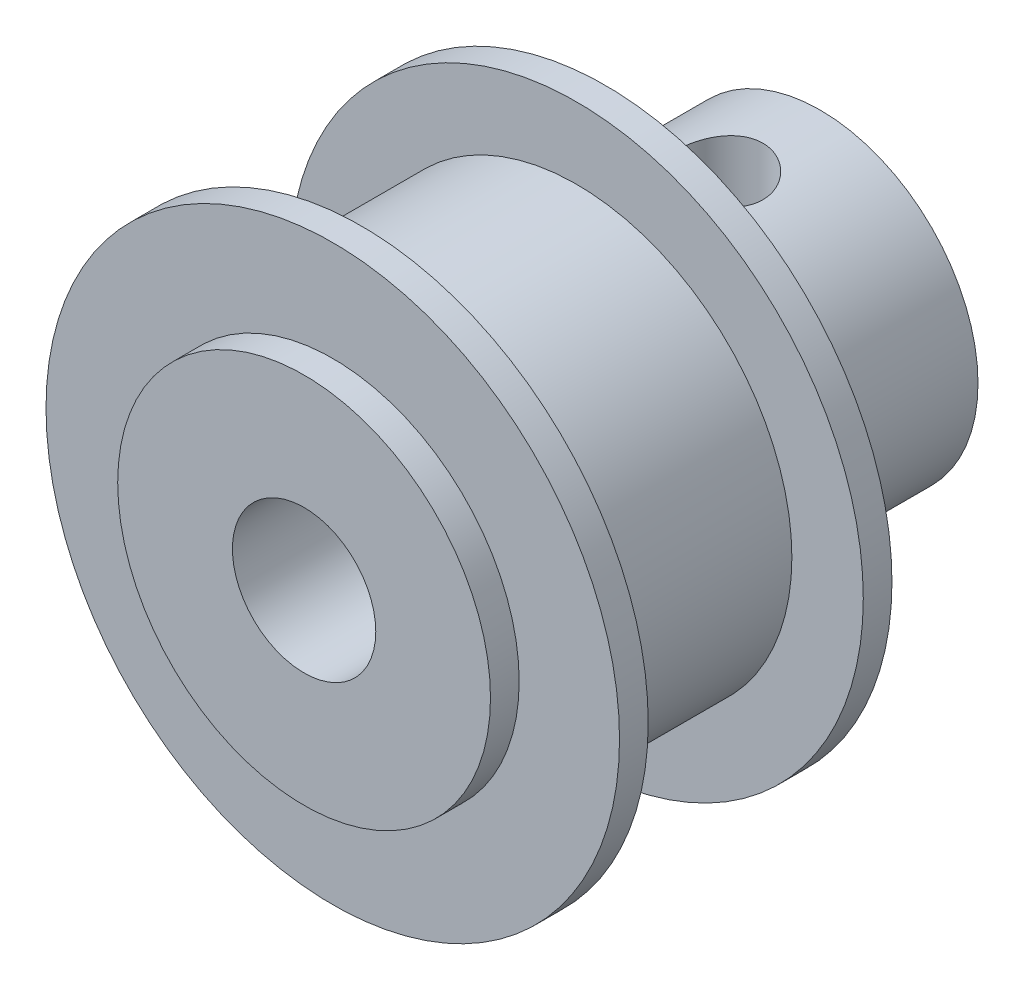
ISO-10303-21;
HEADER;
FILE_DESCRIPTION(('STEP AP214'),'2;1');
FILE_NAME('part.step','',(''),(''),'','','');
FILE_SCHEMA(('AUTOMOTIVE_DESIGN { 1 0 10303 214 1 1 1 1 }'));
ENDSEC;
DATA;
#1=APPLICATION_CONTEXT('core data for automotive mechanical design processes');
#2=APPLICATION_PROTOCOL_DEFINITION('international standard','automotive_design',2000,#1);
#3=PRODUCT_CONTEXT('',#1,'mechanical');
#4=PRODUCT('Part','Part','',(#3));
#5=PRODUCT_RELATED_PRODUCT_CATEGORY('part','',(#4));
#6=PRODUCT_DEFINITION_FORMATION('','',#4);
#7=PRODUCT_DEFINITION_CONTEXT('part definition',#1,'design');
#8=PRODUCT_DEFINITION('design','',#6,#7);
#9=PRODUCT_DEFINITION_SHAPE('','',#8);
#10=(LENGTH_UNIT() NAMED_UNIT(*) SI_UNIT(.MILLI.,.METRE.));
#11=(NAMED_UNIT(*) PLANE_ANGLE_UNIT() SI_UNIT($,.RADIAN.));
#12=(NAMED_UNIT(*) SI_UNIT($,.STERADIAN.) SOLID_ANGLE_UNIT());
#13=UNCERTAINTY_MEASURE_WITH_UNIT(LENGTH_MEASURE(1.E-05),#10,'distance_accuracy_value','');
#14=(GEOMETRIC_REPRESENTATION_CONTEXT(3) GLOBAL_UNCERTAINTY_ASSIGNED_CONTEXT((#13)) GLOBAL_UNIT_ASSIGNED_CONTEXT((#10,
#11,#12)) REPRESENTATION_CONTEXT('',''));
#15=CARTESIAN_POINT('',(0.,0.,0.));
#16=DIRECTION('',(0.,0.,1.));
#17=DIRECTION('',(1.,0.,0.));
#18=AXIS2_PLACEMENT_3D('',#15,#16,#17);
#19=CARTESIAN_POINT('',(0.,0.,6.5));
#20=DIRECTION('',(0.,0.,-1.));
#21=DIRECTION('',(-1.,0.,0.));
#22=AXIS2_PLACEMENT_3D('',#19,#20,#21);
#23=CYLINDRICAL_SURFACE('',#22,5.5);
#24=CARTESIAN_POINT('',(0.,5.5,5.));
#25=CARTESIAN_POINT('',(-0.0826209133321935,5.49999882717412,4.99999818738897));
#26=CARTESIAN_POINT('',(-0.165260978812708,5.49812007260761,4.99315093641658));
#27=CARTESIAN_POINT('',(-0.328155930157697,5.49080798085451,4.96599416969682));
#28=CARTESIAN_POINT('',(-0.408409727977264,5.48537304740499,4.9456786083714));
#29=CARTESIAN_POINT('',(-0.564157626055394,5.47154772174135,4.89229826826157));
#30=CARTESIAN_POINT('',(-0.639657866970163,5.46316123869395,4.85925034733808));
#31=CARTESIAN_POINT('',(-0.784044496159719,5.44431654412848,4.78140706733758));
#32=CARTESIAN_POINT('',(-0.852930363289776,5.43385816956517,4.73661078364607));
#33=CARTESIAN_POINT('',(-0.98379694757326,5.41171397042059,4.63540016353274));
#34=CARTESIAN_POINT('',(-1.04559512916994,5.4000064149043,4.5787545591458));
#35=CARTESIAN_POINT('',(-1.15894293682478,5.37682112935063,4.4559473639701));
#36=CARTESIAN_POINT('',(-1.21049117824721,5.36534343055203,4.38978448959769));
#37=CARTESIAN_POINT('',(-1.30277794539497,5.34369384163659,4.24834875242053));
#38=CARTESIAN_POINT('',(-1.34330426837586,5.33354930058623,4.17293285506372));
#39=CARTESIAN_POINT('',(-1.41102916361227,5.31603507411917,4.01603617180062));
#40=CARTESIAN_POINT('',(-1.43823031946844,5.30866485085754,3.93455656511151));
#41=CARTESIAN_POINT('',(-1.47789456441268,5.2977584719274,3.76987210498753));
#42=CARTESIAN_POINT('',(-1.49068960543229,5.29413612283787,3.68675305183808));
#43=CARTESIAN_POINT('',(-1.50221364409133,5.29087829084083,3.51947531699119));
#44=CARTESIAN_POINT('',(-1.50094540140882,5.2912420257326,3.43531684249998));
#45=CARTESIAN_POINT('',(-1.48464191780301,5.29583824875456,3.27095844903373));
#46=CARTESIAN_POINT('',(-1.47001073668932,5.29995718313671,3.19071476539777));
#47=CARTESIAN_POINT('',(-1.42804483871807,5.3114175579406,3.03386671397719));
#48=CARTESIAN_POINT('',(-1.40070906504647,5.31875926644153,2.9572626495337));
#49=CARTESIAN_POINT('',(-1.3337862982647,5.33593618292326,2.80882647945255));
#50=CARTESIAN_POINT('',(-1.29405951882947,5.34579959764141,2.73706079896638));
#51=CARTESIAN_POINT('',(-1.20357988022174,5.36689368797792,2.60107355259034));
#52=CARTESIAN_POINT('',(-1.15282476106209,5.37812464363249,2.53685353716126));
#53=CARTESIAN_POINT('',(-1.03967346682896,5.40115894990605,2.41547481019356));
#54=CARTESIAN_POINT('',(-0.976938646167249,5.41296874297114,2.35863255071106));
#55=CARTESIAN_POINT('',(-0.842682011788635,5.43548647707978,2.25620903502221));
#56=CARTESIAN_POINT('',(-0.771159819718553,5.44619437064292,2.21062826395038));
#57=CARTESIAN_POINT('',(-0.620853953739623,5.46537278121261,2.13187332722508));
#58=CARTESIAN_POINT('',(-0.542037637417772,5.47383251287305,2.09875866141606));
#59=CARTESIAN_POINT('',(-0.379672688714389,5.48748356142612,2.04634202748586));
#60=CARTESIAN_POINT('',(-0.296125144317681,5.49267562644564,2.02703689755586));
#61=CARTESIAN_POINT('',(-0.12936817048325,5.49909228776313,2.00328938220303));
#62=CARTESIAN_POINT('',(-0.0462242977839796,5.50043163125371,1.99841700467964));
#63=CARTESIAN_POINT('',(0.119693365637973,5.49932301585136,2.00248274751343));
#64=CARTESIAN_POINT('',(0.202467195532508,5.49687546782998,2.01141936961649));
#65=CARTESIAN_POINT('',(0.363745097739557,5.48854239265957,2.04249750270314));
#66=CARTESIAN_POINT('',(0.442299324272677,5.48271986472129,2.06439719275701));
#67=CARTESIAN_POINT('',(0.594609867448632,5.46829923535645,2.12049724464049));
#68=CARTESIAN_POINT('',(0.668365651304997,5.45970082634473,2.15469896966129));
#69=CARTESIAN_POINT('',(0.81064116119459,5.44041573828275,2.23521644228568));
#70=CARTESIAN_POINT('',(0.879024602412583,5.4296902954988,2.28176348726155));
#71=CARTESIAN_POINT('',(1.00716022013082,5.40738988410034,2.38536128754525));
#72=CARTESIAN_POINT('',(1.06691060617763,5.39581474001048,2.44241421615751));
#73=CARTESIAN_POINT('',(1.17791060344312,5.37269401558495,2.56741403803489));
#74=CARTESIAN_POINT('',(1.22885627747222,5.36115944983886,2.63563338227895));
#75=CARTESIAN_POINT('',(1.3185858220796,5.33980026187814,2.77989864721925));
#76=CARTESIAN_POINT('',(1.35737017925923,5.32997557125461,2.85594425460752));
#77=CARTESIAN_POINT('',(1.42138558317209,5.31326248703816,3.01334062824197));
#78=CARTESIAN_POINT('',(1.44669352306985,5.30635748202252,3.09465826052523));
#79=CARTESIAN_POINT('',(1.48320917220692,5.29626814696188,3.26061683802756));
#80=CARTESIAN_POINT('',(1.49442068863148,5.29308281231875,3.34525687955367));
#81=CARTESIAN_POINT('',(1.50219895576908,5.29088009671763,3.51233840381745));
#82=CARTESIAN_POINT('',(1.49925533217026,5.29172336001588,3.59475558872249));
#83=CARTESIAN_POINT('',(1.47994837643976,5.29715501736986,3.75787064773497));
#84=CARTESIAN_POINT('',(1.46358542028567,5.30174330649891,3.83856856994704));
#85=CARTESIAN_POINT('',(1.41819408435119,5.31406316491799,3.99530631577612));
#86=CARTESIAN_POINT('',(1.38927395449127,5.32176783125817,4.07137975324176));
#87=CARTESIAN_POINT('',(1.31967304541386,5.33945189987963,4.21765327681334));
#88=CARTESIAN_POINT('',(1.27899034504456,5.34943167369227,4.28785240106517));
#89=CARTESIAN_POINT('',(1.18555430984851,5.37092379381814,4.42271059769265));
#90=CARTESIAN_POINT('',(1.13246901822125,5.38247375845259,4.48713370484311));
#91=CARTESIAN_POINT('',(1.01636011199274,5.40559990490855,4.6063164067946));
#92=CARTESIAN_POINT('',(0.953334059387994,5.41717609247304,4.66107362400533));
#93=CARTESIAN_POINT('',(0.817407725686078,5.43936459177359,4.7605946145194));
#94=CARTESIAN_POINT('',(0.744315866262519,5.44994907753807,4.80510348086698));
#95=CARTESIAN_POINT('',(0.591399899839278,5.46865263780403,4.88113243621147));
#96=CARTESIAN_POINT('',(0.51157995242122,5.47677322151197,4.91266048055433));
#97=CARTESIAN_POINT('',(0.36010010121821,5.48864193995757,4.95793950997899));
#98=CARTESIAN_POINT('',(0.289064640262467,5.49286947681091,4.9736745512417));
#99=CARTESIAN_POINT('',(0.145357607941484,5.49854887164354,4.99470502531883));
#100=CARTESIAN_POINT('',(0.0726862155649468,5.5000010318002,5.0000015946548));
#101=CARTESIAN_POINT('',(0.,5.5,5.));
#102=B_SPLINE_CURVE_WITH_KNOTS('',3,(#24,#25,#26,#27,#28,#29,#30,#31,#32,#33,#34,#35,#36,#37,
#38,#39,#40,#41,#42,#43,#44,#45,#46,#47,#48,#49,#50,#51,#52,#53,#54,#55,#56,#57,#58,#59,#60,#61,
#62,#63,#64,#65,#66,#67,#68,#69,#70,#71,#72,#73,#74,#75,#76,#77,#78,#79,#80,#81,#82,#83,#84,#85,
#86,#87,#88,#89,#90,#91,#92,#93,#94,#95,#96,#97,#98,#99,#100,#101),.UNSPECIFIED.,.T.,.F.,(4,2,2,
2,2,2,2,2,2,2,2,2,2,2,2,2,2,2,2,2,2,2,2,2,2,2,2,2,2,2,2,2,2,2,2,2,2,2,4),(0.,0.247596106854897,
0.495303428551299,0.742683902420579,0.990083851364706,1.24285878223178,1.49566783659324,
1.75304593650219,2.01037411390996,2.26164304860926,2.51286267696538,2.75672886674887,
3.00061534583717,3.24735926767928,3.49415380139121,3.74938528550775,4.00462776284424,
4.26107349736028,4.51746049766944,4.76612811343082,5.0147687510525,5.25891111200195,
5.50308053475836,5.75219469009681,6.00136043656003,6.25790073064869,6.51443075867912,
6.76948096455404,7.0244622712421,7.27068852228629,7.51690787489588,7.76104555655817,
8.00522313517586,8.25689011392091,8.50861891104974,8.76605872289058,9.02334052607436,
9.24118832093189,9.45901239561305),.UNSPECIFIED.);
#103=CARTESIAN_POINT('',(0.,5.5,5.));
#104=VERTEX_POINT('',#103);
#105=EDGE_CURVE('E10',#104,#104,#102,.T.);
#106=ORIENTED_EDGE('',*,*,#105,.T.);
#107=EDGE_LOOP('',(#106));
#108=FACE_BOUND('',#107,.T.);
#109=CARTESIAN_POINT('',(0.,0.,6.5));
#110=DIRECTION('',(0.,0.,1.));
#111=DIRECTION('',(1.,0.,0.));
#112=AXIS2_PLACEMENT_3D('',#109,#110,#111);
#113=CIRCLE('',#112,5.5);
#114=CARTESIAN_POINT('',(5.5,0.,6.5));
#115=VERTEX_POINT('',#114);
#116=EDGE_CURVE('E64',#115,#115,#113,.T.);
#117=ORIENTED_EDGE('',*,*,#116,.F.);
#118=EDGE_LOOP('',(#117));
#119=FACE_BOUND('',#118,.T.);
#120=CARTESIAN_POINT('',(0.,0.,0.));
#121=DIRECTION('',(0.,0.,1.));
#122=DIRECTION('',(1.,0.,0.));
#123=AXIS2_PLACEMENT_3D('',#120,#121,#122);
#124=CIRCLE('',#123,5.5);
#125=CARTESIAN_POINT('',(5.5,0.,0.));
#126=VERTEX_POINT('',#125);
#127=EDGE_CURVE('E95',#126,#126,#124,.T.);
#128=ORIENTED_EDGE('',*,*,#127,.T.);
#129=EDGE_LOOP('',(#128));
#130=FACE_BOUND('',#129,.T.);
#131=ADVANCED_FACE('F41',(#108,#119,#130),#23,.T.);
#132=CARTESIAN_POINT('',(0.,0.,0.));
#133=DIRECTION('',(0.,0.,1.));
#134=DIRECTION('',(1.,0.,0.));
#135=AXIS2_PLACEMENT_3D('',#132,#133,#134);
#136=PLANE('',#135);
#137=CARTESIAN_POINT('',(0.,0.,0.));
#138=DIRECTION('',(0.,0.,1.));
#139=DIRECTION('',(1.,0.,0.));
#140=AXIS2_PLACEMENT_3D('',#137,#138,#139);
#141=CIRCLE('',#140,2.5);
#142=CARTESIAN_POINT('',(2.5,0.,0.));
#143=VERTEX_POINT('',#142);
#144=EDGE_CURVE('E173',#143,#143,#141,.T.);
#145=ORIENTED_EDGE('',*,*,#144,.T.);
#146=EDGE_LOOP('',(#145));
#147=FACE_BOUND('',#146,.T.);
#148=ORIENTED_EDGE('',*,*,#127,.F.);
#149=EDGE_LOOP('',(#148));
#150=FACE_BOUND('',#149,.T.);
#151=ADVANCED_FACE('F106',(#147,#150),#136,.F.);
#152=CARTESIAN_POINT('',(0.,0.,7.5));
#153=DIRECTION('',(0.,0.,-1.));
#154=DIRECTION('',(-1.,0.,0.));
#155=AXIS2_PLACEMENT_3D('',#152,#153,#154);
#156=CYLINDRICAL_SURFACE('',#155,6.5);
#157=CARTESIAN_POINT('',(0.,0.,7.5));
#158=DIRECTION('',(0.,0.,1.));
#159=DIRECTION('',(1.,0.,0.));
#160=AXIS2_PLACEMENT_3D('',#157,#158,#159);
#161=CIRCLE('',#160,6.5);
#162=CARTESIAN_POINT('',(6.5,0.,7.5));
#163=VERTEX_POINT('',#162);
#164=EDGE_CURVE('E91',#163,#163,#161,.T.);
#165=ORIENTED_EDGE('',*,*,#164,.F.);
#166=EDGE_LOOP('',(#165));
#167=FACE_BOUND('',#166,.T.);
#168=CARTESIAN_POINT('',(0.,0.,6.5));
#169=DIRECTION('',(0.,0.,1.));
#170=DIRECTION('',(1.,0.,0.));
#171=AXIS2_PLACEMENT_3D('',#168,#169,#170);
#172=CIRCLE('',#171,6.5);
#173=CARTESIAN_POINT('',(6.5,0.,6.5));
#174=VERTEX_POINT('',#173);
#175=EDGE_CURVE('E87',#174,#174,#172,.T.);
#176=ORIENTED_EDGE('',*,*,#175,.T.);
#177=EDGE_LOOP('',(#176));
#178=FACE_BOUND('',#177,.T.);
#179=ADVANCED_FACE('F108',(#167,#178),#156,.T.);
#180=CARTESIAN_POINT('',(0.,0.,6.5));
#181=DIRECTION('',(0.,0.,1.));
#182=DIRECTION('',(1.,0.,0.));
#183=AXIS2_PLACEMENT_3D('',#180,#181,#182);
#184=PLANE('',#183);
#185=ORIENTED_EDGE('',*,*,#116,.T.);
#186=EDGE_LOOP('',(#185));
#187=FACE_BOUND('',#186,.T.);
#188=ORIENTED_EDGE('',*,*,#175,.F.);
#189=EDGE_LOOP('',(#188));
#190=FACE_BOUND('',#189,.T.);
#191=ADVANCED_FACE('F114',(#187,#190),#184,.F.);
#192=CARTESIAN_POINT('',(0.,0.,8.5));
#193=DIRECTION('',(0.,0.,-1.));
#194=DIRECTION('',(-1.,0.,0.));
#195=AXIS2_PLACEMENT_3D('',#192,#193,#194);
#196=CYLINDRICAL_SURFACE('',#195,10.);
#197=CARTESIAN_POINT('',(0.,0.,8.5));
#198=DIRECTION('',(0.,0.,1.));
#199=DIRECTION('',(1.,0.,0.));
#200=AXIS2_PLACEMENT_3D('',#197,#198,#199);
#201=CIRCLE('',#200,10.);
#202=CARTESIAN_POINT('',(10.,0.,8.5));
#203=VERTEX_POINT('',#202);
#204=EDGE_CURVE('E83',#203,#203,#201,.T.);
#205=ORIENTED_EDGE('',*,*,#204,.F.);
#206=EDGE_LOOP('',(#205));
#207=FACE_BOUND('',#206,.T.);
#208=CARTESIAN_POINT('',(0.,0.,7.5));
#209=DIRECTION('',(0.,0.,1.));
#210=DIRECTION('',(1.,0.,0.));
#211=AXIS2_PLACEMENT_3D('',#208,#209,#210);
#212=CIRCLE('',#211,10.);
#213=CARTESIAN_POINT('',(10.,0.,7.5));
#214=VERTEX_POINT('',#213);
#215=EDGE_CURVE('E81',#214,#214,#212,.T.);
#216=ORIENTED_EDGE('',*,*,#215,.T.);
#217=EDGE_LOOP('',(#216));
#218=FACE_BOUND('',#217,.T.);
#219=ADVANCED_FACE('F121',(#207,#218),#196,.T.);
#220=CARTESIAN_POINT('',(0.,0.,8.5));
#221=DIRECTION('',(0.,0.,1.));
#222=DIRECTION('',(1.,0.,0.));
#223=AXIS2_PLACEMENT_3D('',#220,#221,#222);
#224=PLANE('',#223);
#225=CARTESIAN_POINT('',(0.,0.,8.5));
#226=DIRECTION('',(0.,0.,1.));
#227=DIRECTION('',(1.,0.,0.));
#228=AXIS2_PLACEMENT_3D('',#225,#226,#227);
#229=CIRCLE('',#228,7.51);
#230=CARTESIAN_POINT('',(7.51,0.,8.5));
#231=VERTEX_POINT('',#230);
#232=EDGE_CURVE('E58',#231,#231,#229,.T.);
#233=ORIENTED_EDGE('',*,*,#232,.F.);
#234=EDGE_LOOP('',(#233));
#235=FACE_BOUND('',#234,.T.);
#236=ORIENTED_EDGE('',*,*,#204,.T.);
#237=EDGE_LOOP('',(#236));
#238=FACE_BOUND('',#237,.T.);
#239=ADVANCED_FACE('F125',(#235,#238),#224,.T.);
#240=CARTESIAN_POINT('',(0.,0.,7.5));
#241=DIRECTION('',(0.,0.,1.));
#242=DIRECTION('',(1.,0.,0.));
#243=AXIS2_PLACEMENT_3D('',#240,#241,#242);
#244=PLANE('',#243);
#245=ORIENTED_EDGE('',*,*,#164,.T.);
#246=EDGE_LOOP('',(#245));
#247=FACE_BOUND('',#246,.T.);
#248=ORIENTED_EDGE('',*,*,#215,.F.);
#249=EDGE_LOOP('',(#248));
#250=FACE_BOUND('',#249,.T.);
#251=ADVANCED_FACE('F127',(#247,#250),#244,.F.);
#252=CARTESIAN_POINT('',(0.,0.,16.));
#253=DIRECTION('',(0.,0.,-1.));
#254=DIRECTION('',(-1.,0.,0.));
#255=AXIS2_PLACEMENT_3D('',#252,#253,#254);
#256=CYLINDRICAL_SURFACE('',#255,7.51);
#257=CARTESIAN_POINT('',(0.,0.,16.));
#258=DIRECTION('',(0.,0.,1.));
#259=DIRECTION('',(1.,0.,0.));
#260=AXIS2_PLACEMENT_3D('',#257,#258,#259);
#261=CIRCLE('',#260,7.51);
#262=CARTESIAN_POINT('',(7.51,0.,16.));
#263=VERTEX_POINT('',#262);
#264=EDGE_CURVE('E74',#263,#263,#261,.T.);
#265=ORIENTED_EDGE('',*,*,#264,.F.);
#266=EDGE_LOOP('',(#265));
#267=FACE_BOUND('',#266,.T.);
#268=ORIENTED_EDGE('',*,*,#232,.T.);
#269=EDGE_LOOP('',(#268));
#270=FACE_BOUND('',#269,.T.);
#271=ADVANCED_FACE('F130',(#267,#270),#256,.T.);
#272=CARTESIAN_POINT('',(0.,0.,17.));
#273=DIRECTION('',(0.,0.,-1.));
#274=DIRECTION('',(-1.,0.,0.));
#275=AXIS2_PLACEMENT_3D('',#272,#273,#274);
#276=CYLINDRICAL_SURFACE('',#275,10.);
#277=CARTESIAN_POINT('',(0.,0.,17.));
#278=DIRECTION('',(0.,0.,1.));
#279=DIRECTION('',(1.,0.,0.));
#280=AXIS2_PLACEMENT_3D('',#277,#278,#279);
#281=CIRCLE('',#280,10.);
#282=CARTESIAN_POINT('',(10.,0.,17.));
#283=VERTEX_POINT('',#282);
#284=EDGE_CURVE('E70',#283,#283,#281,.T.);
#285=ORIENTED_EDGE('',*,*,#284,.F.);
#286=EDGE_LOOP('',(#285));
#287=FACE_BOUND('',#286,.T.);
#288=CARTESIAN_POINT('',(0.,0.,16.));
#289=DIRECTION('',(0.,0.,1.));
#290=DIRECTION('',(1.,0.,0.));
#291=AXIS2_PLACEMENT_3D('',#288,#289,#290);
#292=CIRCLE('',#291,10.);
#293=CARTESIAN_POINT('',(10.,0.,16.));
#294=VERTEX_POINT('',#293);
#295=EDGE_CURVE('E75',#294,#294,#292,.T.);
#296=ORIENTED_EDGE('',*,*,#295,.T.);
#297=EDGE_LOOP('',(#296));
#298=FACE_BOUND('',#297,.T.);
#299=ADVANCED_FACE('F137',(#287,#298),#276,.T.);
#300=CARTESIAN_POINT('',(0.,0.,17.));
#301=DIRECTION('',(0.,0.,1.));
#302=DIRECTION('',(1.,0.,0.));
#303=AXIS2_PLACEMENT_3D('',#300,#301,#302);
#304=PLANE('',#303);
#305=CARTESIAN_POINT('',(0.,0.,17.));
#306=DIRECTION('',(0.,0.,1.));
#307=DIRECTION('',(1.,0.,0.));
#308=AXIS2_PLACEMENT_3D('',#305,#306,#307);
#309=CIRCLE('',#308,6.5);
#310=CARTESIAN_POINT('',(6.5,0.,17.));
#311=VERTEX_POINT('',#310);
#312=EDGE_CURVE('E53',#311,#311,#309,.T.);
#313=ORIENTED_EDGE('',*,*,#312,.F.);
#314=EDGE_LOOP('',(#313));
#315=FACE_BOUND('',#314,.T.);
#316=ORIENTED_EDGE('',*,*,#284,.T.);
#317=EDGE_LOOP('',(#316));
#318=FACE_BOUND('',#317,.T.);
#319=ADVANCED_FACE('F141',(#315,#318),#304,.T.);
#320=CARTESIAN_POINT('',(0.,0.,16.));
#321=DIRECTION('',(0.,0.,1.));
#322=DIRECTION('',(1.,0.,0.));
#323=AXIS2_PLACEMENT_3D('',#320,#321,#322);
#324=PLANE('',#323);
#325=ORIENTED_EDGE('',*,*,#264,.T.);
#326=EDGE_LOOP('',(#325));
#327=FACE_BOUND('',#326,.T.);
#328=ORIENTED_EDGE('',*,*,#295,.F.);
#329=EDGE_LOOP('',(#328));
#330=FACE_BOUND('',#329,.T.);
#331=ADVANCED_FACE('F143',(#327,#330),#324,.F.);
#332=CARTESIAN_POINT('',(0.,0.,18.));
#333=DIRECTION('',(0.,0.,-1.));
#334=DIRECTION('',(-1.,0.,0.));
#335=AXIS2_PLACEMENT_3D('',#332,#333,#334);
#336=CYLINDRICAL_SURFACE('',#335,6.5);
#337=CARTESIAN_POINT('',(0.,0.,18.));
#338=DIRECTION('',(0.,0.,1.));
#339=DIRECTION('',(1.,0.,0.));
#340=AXIS2_PLACEMENT_3D('',#337,#338,#339);
#341=CIRCLE('',#340,6.5);
#342=CARTESIAN_POINT('',(6.5,0.,18.));
#343=VERTEX_POINT('',#342);
#344=EDGE_CURVE('E68',#343,#343,#341,.T.);
#345=ORIENTED_EDGE('',*,*,#344,.F.);
#346=EDGE_LOOP('',(#345));
#347=FACE_BOUND('',#346,.T.);
#348=ORIENTED_EDGE('',*,*,#312,.T.);
#349=EDGE_LOOP('',(#348));
#350=FACE_BOUND('',#349,.T.);
#351=ADVANCED_FACE('F146',(#347,#350),#336,.T.);
#352=CARTESIAN_POINT('',(0.,0.,18.));
#353=DIRECTION('',(0.,0.,1.));
#354=DIRECTION('',(1.,0.,0.));
#355=AXIS2_PLACEMENT_3D('',#352,#353,#354);
#356=PLANE('',#355);
#357=CARTESIAN_POINT('',(0.,0.,18.));
#358=DIRECTION('',(0.,0.,1.));
#359=DIRECTION('',(1.,0.,0.));
#360=AXIS2_PLACEMENT_3D('',#357,#358,#359);
#361=CIRCLE('',#360,2.5);
#362=CARTESIAN_POINT('',(2.5,0.,18.));
#363=VERTEX_POINT('',#362);
#364=EDGE_CURVE('E172',#363,#363,#361,.T.);
#365=ORIENTED_EDGE('',*,*,#364,.F.);
#366=EDGE_LOOP('',(#365));
#367=FACE_BOUND('',#366,.T.);
#368=ORIENTED_EDGE('',*,*,#344,.T.);
#369=EDGE_LOOP('',(#368));
#370=FACE_BOUND('',#369,.T.);
#371=ADVANCED_FACE('F153',(#367,#370),#356,.T.);
#372=CARTESIAN_POINT('',(0.,0.,0.));
#373=DIRECTION('',(0.,0.,1.));
#374=DIRECTION('',(1.,0.,0.));
#375=AXIS2_PLACEMENT_3D('',#372,#373,#374);
#376=CYLINDRICAL_SURFACE('',#375,2.5);
#377=CARTESIAN_POINT('',(0.,2.5,5.));
#378=CARTESIAN_POINT('',(0.0767298334620161,2.49999625789732,4.99999590899012));
#379=CARTESIAN_POINT('',(0.153582320644178,2.4964290461501,4.99407132907374));
#380=CARTESIAN_POINT('',(0.304975509530679,2.48249903608568,4.97067568048467));
#381=CARTESIAN_POINT('',(0.379510034596047,2.47211948032719,4.95317613814577));
#382=CARTESIAN_POINT('',(0.523751827790837,2.44561558054488,4.90761363883314));
#383=CARTESIAN_POINT('',(0.593481028226566,2.42951973272944,4.87960304183684));
#384=CARTESIAN_POINT('',(0.727030318214659,2.39295367626407,4.81413966685897));
#385=CARTESIAN_POINT('',(0.790851869416383,2.37248455380255,4.77668923303125));
#386=CARTESIAN_POINT('',(0.916299278999315,2.32705360719088,4.69022517329142));
#387=CARTESIAN_POINT('',(0.977384020081415,2.30186792195985,4.64054630464861));
#388=CARTESIAN_POINT('',(1.09088270411891,2.25030439279634,4.53253279617173));
#389=CARTESIAN_POINT('',(1.14328534948112,2.22392505153571,4.47418706281268));
#390=CARTESIAN_POINT('',(1.24444996762974,2.1691106699591,4.34207648950327));
#391=CARTESIAN_POINT('',(1.29197766378809,2.14082017703649,4.26729822901871));
#392=CARTESIAN_POINT('',(1.37361437764896,2.08938301412124,4.10915342675689));
#393=CARTESIAN_POINT('',(1.4077451733516,2.06622802273938,4.02580110375243));
#394=CARTESIAN_POINT('',(1.45440601714221,2.0335462966093,3.87340354934676));
#395=CARTESIAN_POINT('',(1.47016197246826,2.02207883137591,3.80576400138968));
#396=CARTESIAN_POINT('',(1.49216172340475,2.00590308295503,3.66819628416964));
#397=CARTESIAN_POINT('',(1.49841734556836,2.0011863964376,3.59827107124551));
#398=CARTESIAN_POINT('',(1.50105508796009,1.99920922463856,3.45798850578266));
#399=CARTESIAN_POINT('',(1.49741783408418,2.00196337012718,3.3876305749068));
#400=CARTESIAN_POINT('',(1.48046060478828,2.01453261443742,3.24872122457241));
#401=CARTESIAN_POINT('',(1.46713334620103,2.02435302432226,3.18017120415256));
#402=CARTESIAN_POINT('',(1.43173921881792,2.04953186944258,3.04746975787189));
#403=CARTESIAN_POINT('',(1.40978748666087,2.06481711652537,2.98327294607552));
#404=CARTESIAN_POINT('',(1.35795061770837,2.09927051350828,2.85930500907188));
#405=CARTESIAN_POINT('',(1.32806257259705,2.11844008623465,2.79953551657607));
#406=CARTESIAN_POINT('',(1.25517983184583,2.16255327268985,2.6750159028772));
#407=CARTESIAN_POINT('',(1.21080724397723,2.18792043372992,2.61122190704507));
#408=CARTESIAN_POINT('',(1.11291092784003,2.23930599764381,2.49132351633299));
#409=CARTESIAN_POINT('',(1.05937845100578,2.26532500262149,2.43522656602349));
#410=CARTESIAN_POINT('',(0.935811834382964,2.31935504958317,2.32438701817824));
#411=CARTESIAN_POINT('',(0.864517682704955,2.34713836268533,2.27092269398401));
#412=CARTESIAN_POINT('',(0.712276050458998,2.39772428433981,2.17687795280209));
#413=CARTESIAN_POINT('',(0.631333763943562,2.42052955425515,2.13629064621005));
#414=CARTESIAN_POINT('',(0.467197585268204,2.45730392066151,2.0720678172041));
#415=CARTESIAN_POINT('',(0.384467624173578,2.47173957439704,2.04752464428409));
#416=CARTESIAN_POINT('',(0.215047895144638,2.49218842813551,2.01298880259462));
#417=CARTESIAN_POINT('',(0.128363005661318,2.49821172952738,2.00297868224643));
#418=CARTESIAN_POINT('',(-0.0337146143773978,2.5009057037461,1.99849215232169));
#419=CARTESIAN_POINT('',(-0.109042473418719,2.49873521714286,2.00209114491483));
#420=CARTESIAN_POINT('',(-0.257829401986062,2.48778712087049,2.02042585307192));
#421=CARTESIAN_POINT('',(-0.331288509376107,2.47900964518037,2.03516134280581));
#422=CARTESIAN_POINT('',(-0.472574932157614,2.4559479244219,2.07454343281246));
#423=CARTESIAN_POINT('',(-0.540495750928484,2.44180275662555,2.09894034907347));
#424=CARTESIAN_POINT('',(-0.671265749087263,2.40913880862845,2.15667737636527));
#425=CARTESIAN_POINT('',(-0.734113924963909,2.39061916586511,2.19001925134667));
#426=CARTESIAN_POINT('',(-0.860006262823864,2.3484549623736,2.26855697920871));
#427=CARTESIAN_POINT('',(-0.922394150456837,2.3244780273988,2.3146238290784));
#428=CARTESIAN_POINT('',(-1.03902603131014,2.27474265574732,2.41539139348862));
#429=CARTESIAN_POINT('',(-1.09326040273738,2.2489821658636,2.47010215485254));
#430=CARTESIAN_POINT('',(-1.19931996735579,2.19445423909891,2.59491039003715));
#431=CARTESIAN_POINT('',(-1.24991019630915,2.16573241746291,2.66608388546551));
#432=CARTESIAN_POINT('',(-1.33845238915667,2.1121618206671,2.81721602456821));
#433=CARTESIAN_POINT('',(-1.37641766769781,2.0873089799769,2.89716529389279));
#434=CARTESIAN_POINT('',(-1.43142578795776,2.04984909240519,3.04624302230669));
#435=CARTESIAN_POINT('',(-1.4512162533619,2.03575659328729,3.11398031235859));
#436=CARTESIAN_POINT('',(-1.48113663905972,2.01409605743544,3.25253207808011));
#437=CARTESIAN_POINT('',(-1.4912799529763,2.00651897642721,3.32334214432783));
#438=CARTESIAN_POINT('',(-1.50134130416631,1.99900446616268,3.46637694759704));
#439=CARTESIAN_POINT('',(-1.50122089107869,1.99909576445937,3.53860599068705));
#440=CARTESIAN_POINT('',(-1.49066472959328,2.0069771789285,3.68189443560946));
#441=CARTESIAN_POINT('',(-1.48022337215758,2.0147714813882,3.7529531800806));
#442=CARTESIAN_POINT('',(-1.45040174148913,2.0363318524298,3.88848841757219));
#443=CARTESIAN_POINT('',(-1.43147636845351,2.04979211805581,3.95311709430687));
#444=CARTESIAN_POINT('',(-1.38563242076993,2.08105501960152,4.07833725447422));
#445=CARTESIAN_POINT('',(-1.35871083588479,2.09885929040482,4.13892720696056));
#446=CARTESIAN_POINT('',(-1.29289245555732,2.14012990550917,4.26431985722078));
#447=CARTESIAN_POINT('',(-1.25279167675753,2.1640458758264,4.32834110385431));
#448=CARTESIAN_POINT('',(-1.16375698389084,2.21320127030768,4.44938007261729));
#449=CARTESIAN_POINT('',(-1.11481579607798,2.23844177205021,4.50639196215256));
#450=CARTESIAN_POINT('',(-1.00009777425734,2.29225690291477,4.62135094913168));
#451=CARTESIAN_POINT('',(-0.9328768193139,2.32070308663658,4.67793107489619));
#452=CARTESIAN_POINT('',(-0.788462434445584,2.37365428872367,4.77909785586331));
#453=CARTESIAN_POINT('',(-0.711265444501535,2.39815789310936,4.82368021198479));
#454=CARTESIAN_POINT('',(-0.551125230801449,2.43985578654394,4.89778580757374));
#455=CARTESIAN_POINT('',(-0.46843008695721,2.45725077479787,4.92772806492683));
#456=CARTESIAN_POINT('',(-0.297973306118804,2.48366273001246,4.97272469521098));
#457=CARTESIAN_POINT('',(-0.210232099648608,2.49271125871485,4.98783516785699));
#458=CARTESIAN_POINT('',(-0.101558096917533,2.49802001168187,4.99669745470866));
#459=CARTESIAN_POINT('',(-0.0812762590282747,2.49876114656362,4.9979344173061));
#460=CARTESIAN_POINT('',(-0.0406658206871108,2.49975164517367,4.99958624637086));
#461=CARTESIAN_POINT('',(-0.0203372186375684,2.50000099184316,5.0000010843209));
#462=CARTESIAN_POINT('',(0.,2.5,5.));
#463=B_SPLINE_CURVE_WITH_KNOTS('',3,(#377,#378,#379,#380,#381,#382,#383,#384,#385,#386,#387,
#388,#389,#390,#391,#392,#393,#394,#395,#396,#397,#398,#399,#400,#401,#402,#403,#404,#405,#406,
#407,#408,#409,#410,#411,#412,#413,#414,#415,#416,#417,#418,#419,#420,#421,#422,#423,#424,#425,
#426,#427,#428,#429,#430,#431,#432,#433,#434,#435,#436,#437,#438,#439,#440,#441,#442,#443,#444,
#445,#446,#447,#448,#449,#450,#451,#452,#453,#454,#455,#456,#457,#458,#459,#460,#461,#462),
.UNSPECIFIED.,.T.,.F.,(4,2,2,2,2,2,2,2,2,2,2,2,2,2,2,2,2,2,2,2,2,2,2,2,2,2,2,2,2,2,2,2,2,2,2,2,
2,2,2,2,2,2,4),(0.,0.230102237548649,0.460772627520012,0.690308884600012,0.919788197992275,
1.16681590732472,1.414162579348,1.69183813189807,1.96906040692092,2.17933829855633,
2.38935420916578,2.59978170870726,2.81036753273872,3.01823267593207,3.22617409809868,
3.47046995225163,3.71500044803674,3.99360957884691,4.27206939275324,4.53296790696559,
4.79355286918236,5.01875602722426,5.24395461863455,5.46367785689772,5.68344445659025,
5.92601365818361,6.16886690081836,6.44336762428009,6.71757792616456,6.93257787314692,
7.14727888733318,7.36278425777432,7.57840681155725,7.78364098331141,7.98895251523034,
8.22578610052286,8.46281544370207,8.73854311775518,9.01436946031985,9.28175654462676,
9.54812832184448,9.60911473335176,9.6701032602764),.UNSPECIFIED.);
#464=CARTESIAN_POINT('',(0.,2.5,5.));
#465=VERTEX_POINT('',#464);
#466=EDGE_CURVE('E165',#465,#465,#463,.T.);
#467=ORIENTED_EDGE('',*,*,#466,.T.);
#468=EDGE_LOOP('',(#467));
#469=FACE_BOUND('',#468,.T.);
#470=ORIENTED_EDGE('',*,*,#144,.F.);
#471=EDGE_LOOP('',(#470));
#472=FACE_BOUND('',#471,.T.);
#473=ORIENTED_EDGE('',*,*,#364,.T.);
#474=EDGE_LOOP('',(#473));
#475=FACE_BOUND('',#474,.T.);
#476=ADVANCED_FACE('F157',(#469,#472,#475),#376,.F.);
#477=CARTESIAN_POINT('',(0.,5.5,3.5));
#478=DIRECTION('',(0.,1.,0.));
#479=DIRECTION('',(0.,0.,1.));
#480=AXIS2_PLACEMENT_3D('',#477,#478,#479);
#481=CYLINDRICAL_SURFACE('',#480,1.5);
#482=ORIENTED_EDGE('',*,*,#105,.F.);
#483=EDGE_LOOP('',(#482));
#484=FACE_BOUND('',#483,.T.);
#485=ORIENTED_EDGE('',*,*,#466,.F.);
#486=EDGE_LOOP('',(#485));
#487=FACE_BOUND('',#486,.T.);
#488=ADVANCED_FACE('F161',(#484,#487),#481,.F.);
#489=CLOSED_SHELL('',(#131,#151,#179,#191,#219,#239,#251,#271,#299,#319,#331,#351,#371,#476,#488));
#490=MANIFOLD_SOLID_BREP('B2',#489);
#491=ADVANCED_BREP_SHAPE_REPRESENTATION('',(#18,#490),#14);
#492=SHAPE_DEFINITION_REPRESENTATION(#9,#491);
ENDSEC;
END-ISO-10303-21;
